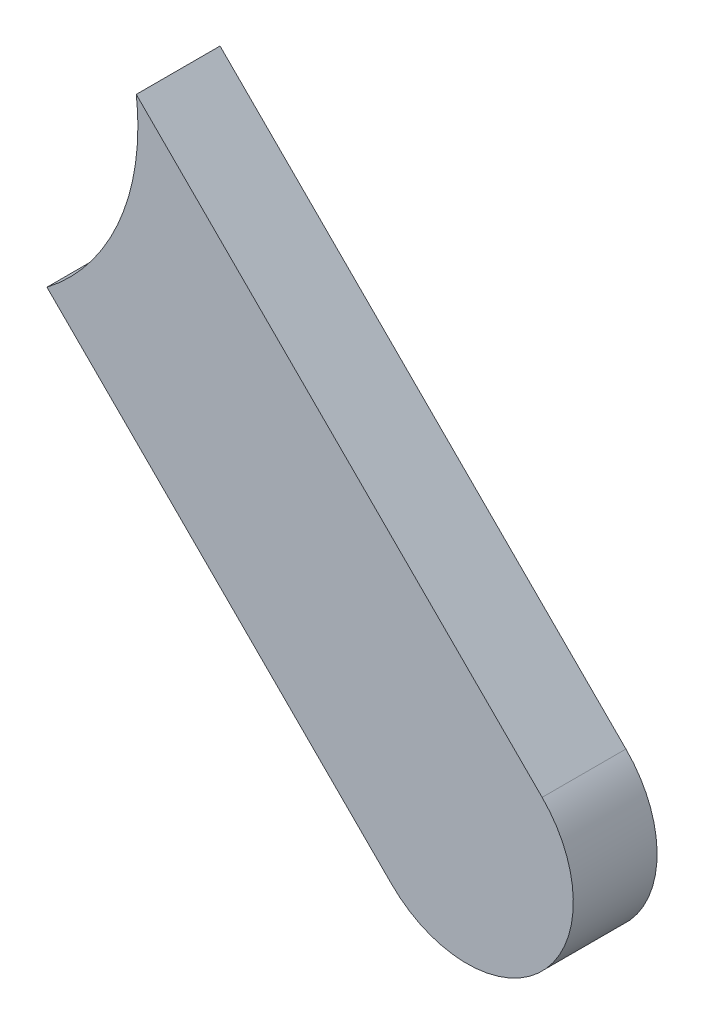
ISO-10303-21;
HEADER;
FILE_DESCRIPTION(('STEP AP214'),'2;1');
FILE_NAME('part.step','',(''),(''),'','','');
FILE_SCHEMA(('AUTOMOTIVE_DESIGN { 1 0 10303 214 1 1 1 1 }'));
ENDSEC;
DATA;
#1=APPLICATION_CONTEXT('core data for automotive mechanical design processes');
#2=APPLICATION_PROTOCOL_DEFINITION('international standard','automotive_design',2000,#1);
#3=PRODUCT_CONTEXT('',#1,'mechanical');
#4=PRODUCT('Part','Part','',(#3));
#5=PRODUCT_RELATED_PRODUCT_CATEGORY('part','',(#4));
#6=PRODUCT_DEFINITION_FORMATION('','',#4);
#7=PRODUCT_DEFINITION_CONTEXT('part definition',#1,'design');
#8=PRODUCT_DEFINITION('design','',#6,#7);
#9=PRODUCT_DEFINITION_SHAPE('','',#8);
#10=(LENGTH_UNIT() NAMED_UNIT(*) SI_UNIT(.MILLI.,.METRE.));
#11=(NAMED_UNIT(*) PLANE_ANGLE_UNIT() SI_UNIT($,.RADIAN.));
#12=(NAMED_UNIT(*) SI_UNIT($,.STERADIAN.) SOLID_ANGLE_UNIT());
#13=UNCERTAINTY_MEASURE_WITH_UNIT(LENGTH_MEASURE(1.E-05),#10,'distance_accuracy_value','');
#14=(GEOMETRIC_REPRESENTATION_CONTEXT(3) GLOBAL_UNCERTAINTY_ASSIGNED_CONTEXT((#13)) GLOBAL_UNIT_ASSIGNED_CONTEXT((#10,
#11,#12)) REPRESENTATION_CONTEXT('',''));
#15=CARTESIAN_POINT('',(0.,0.,0.));
#16=DIRECTION('',(0.,0.,1.));
#17=DIRECTION('',(1.,0.,0.));
#18=AXIS2_PLACEMENT_3D('',#15,#16,#17);
#19=CARTESIAN_POINT('',(149.308994996922,70.168793123078,0.));
#20=DIRECTION('',(0.707106781186543,0.707106781186552,0.));
#21=DIRECTION('',(0.707106781186552,-0.707106781186543,0.));
#22=AXIS2_PLACEMENT_3D('',#19,#20,#21);
#23=PLANE('',#22);
#24=DIRECTION('',(0.707106781186552,-0.707106781186543,0.));
#25=VECTOR('',#24,1.);
#26=CARTESIAN_POINT('',(149.04839126,70.42939686,0.1999996));
#27=LINE('',#26,#25);
#28=CARTESIAN_POINT('',(149.308994996922,70.168793123078,0.1999996));
#29=VERTEX_POINT('',#28);
#30=CARTESIAN_POINT('',(150.1318943,69.34589382,0.1999996));
#31=VERTEX_POINT('',#30);
#32=EDGE_CURVE('E11',#29,#31,#27,.T.);
#33=ORIENTED_EDGE('',*,*,#32,.F.);
#34=DIRECTION('',(0.,0.,1.));
#35=VECTOR('',#34,1.);
#36=CARTESIAN_POINT('',(149.308994996922,70.168793123078,0.));
#37=LINE('',#36,#35);
#38=CARTESIAN_POINT('',(149.308994996922,70.168793123078,0.));
#39=VERTEX_POINT('',#38);
#40=EDGE_CURVE('E24',#39,#29,#37,.T.);
#41=ORIENTED_EDGE('',*,*,#40,.F.);
#42=DIRECTION('',(0.707106781186552,-0.707106781186543,0.));
#43=VECTOR('',#42,1.);
#44=CARTESIAN_POINT('',(149.04839126,70.42939686,0.));
#45=LINE('',#44,#43);
#46=CARTESIAN_POINT('',(150.1318943,69.34589382,0.));
#47=VERTEX_POINT('',#46);
#48=EDGE_CURVE('E82',#39,#47,#45,.T.);
#49=ORIENTED_EDGE('',*,*,#48,.T.);
#50=DIRECTION('',(0.,0.,1.));
#51=VECTOR('',#50,1.);
#52=CARTESIAN_POINT('',(150.1318943,69.34589382,0.));
#53=LINE('',#52,#51);
#54=EDGE_CURVE('E37',#47,#31,#53,.T.);
#55=ORIENTED_EDGE('',*,*,#54,.T.);
#56=EDGE_LOOP('',(#33,#41,#49,#55));
#57=FACE_BOUND('',#56,.T.);
#58=ADVANCED_FACE('F17',(#57),#23,.F.);
#59=CARTESIAN_POINT('',(150.31150024,69.52549976,0.));
#60=DIRECTION('',(0.,0.,-1.));
#61=DIRECTION('',(-0.70710678118652,-0.707106781186576,0.));
#62=AXIS2_PLACEMENT_3D('',#59,#60,#61);
#63=CYLINDRICAL_SURFACE('',#62,0.254001156230774);
#64=CARTESIAN_POINT('',(150.31150024,69.52549976,0.1999996));
#65=DIRECTION('',(0.,0.,1.));
#66=DIRECTION('',(-0.70710678118652,-0.707106781186576,0.));
#67=AXIS2_PLACEMENT_3D('',#64,#65,#66);
#68=CIRCLE('',#67,0.254001156230774);
#69=CARTESIAN_POINT('',(150.49110618,69.7051057,0.1999996));
#70=VERTEX_POINT('',#69);
#71=EDGE_CURVE('E97',#31,#70,#68,.T.);
#72=ORIENTED_EDGE('',*,*,#71,.F.);
#73=ORIENTED_EDGE('',*,*,#54,.F.);
#74=CARTESIAN_POINT('',(150.31150024,69.52549976,0.));
#75=DIRECTION('',(0.,0.,1.));
#76=DIRECTION('',(-0.70710678118652,-0.707106781186576,0.));
#77=AXIS2_PLACEMENT_3D('',#74,#75,#76);
#78=CIRCLE('',#77,0.254001156230774);
#79=CARTESIAN_POINT('',(150.49110618,69.7051057,0.));
#80=VERTEX_POINT('',#79);
#81=EDGE_CURVE('E94',#47,#80,#78,.T.);
#82=ORIENTED_EDGE('',*,*,#81,.T.);
#83=DIRECTION('',(0.,0.,1.));
#84=VECTOR('',#83,1.);
#85=CARTESIAN_POINT('',(150.49110618,69.7051057,0.));
#86=LINE('',#85,#84);
#87=EDGE_CURVE('E92',#80,#70,#86,.T.);
#88=ORIENTED_EDGE('',*,*,#87,.T.);
#89=EDGE_LOOP('',(#72,#73,#82,#88));
#90=FACE_BOUND('',#89,.T.);
#91=ADVANCED_FACE('F103',(#90),#63,.T.);
#92=CARTESIAN_POINT('',(150.49110618,69.7051057,0.));
#93=DIRECTION('',(-0.707106781186543,-0.707106781186552,0.));
#94=DIRECTION('',(-0.707106781186552,0.707106781186543,0.));
#95=AXIS2_PLACEMENT_3D('',#92,#93,#94);
#96=PLANE('',#95);
#97=DIRECTION('',(-0.707106781186552,0.707106781186543,0.));
#98=VECTOR('',#97,1.);
#99=CARTESIAN_POINT('',(150.49110618,69.7051057,0.1999996));
#100=LINE('',#99,#98);
#101=CARTESIAN_POINT('',(149.522176918586,70.6740349614141,0.1999996));
#102=VERTEX_POINT('',#101);
#103=EDGE_CURVE('E89',#70,#102,#100,.T.);
#104=ORIENTED_EDGE('',*,*,#103,.F.);
#105=ORIENTED_EDGE('',*,*,#87,.F.);
#106=DIRECTION('',(-0.707106781186552,0.707106781186543,0.));
#107=VECTOR('',#106,1.);
#108=CARTESIAN_POINT('',(150.49110618,69.7051057,0.));
#109=LINE('',#108,#107);
#110=CARTESIAN_POINT('',(149.522176918586,70.6740349614141,0.));
#111=VERTEX_POINT('',#110);
#112=EDGE_CURVE('E87',#80,#111,#109,.T.);
#113=ORIENTED_EDGE('',*,*,#112,.T.);
#114=DIRECTION('',(0.,0.,1.));
#115=VECTOR('',#114,1.);
#116=CARTESIAN_POINT('',(149.522176918586,70.6740349614141,0.));
#117=LINE('',#116,#115);
#118=EDGE_CURVE('E69',#111,#102,#117,.T.);
#119=ORIENTED_EDGE('',*,*,#118,.T.);
#120=EDGE_LOOP('',(#104,#105,#113,#119));
#121=FACE_BOUND('',#120,.T.);
#122=ADVANCED_FACE('F108',(#121),#96,.F.);
#123=CARTESIAN_POINT('',(148.971,70.6090028,0.));
#124=DIRECTION('',(0.,0.,-1.));
#125=DIRECTION('',(1.,0.,0.));
#126=AXIS2_PLACEMENT_3D('',#123,#124,#125);
#127=CYLINDRICAL_SURFACE('',#126,0.55500016);
#128=DIRECTION('',(0.,0.,1.));
#129=VECTOR('',#128,1.);
#130=CARTESIAN_POINT('',(149.52600016,70.6090028,0.));
#131=LINE('',#130,#129);
#132=CARTESIAN_POINT('',(149.52600016,70.6090028,0.));
#133=VERTEX_POINT('',#132);
#134=CARTESIAN_POINT('',(149.52600016,70.6090028,0.1999996));
#135=VERTEX_POINT('',#134);
#136=EDGE_CURVE('E59',#133,#135,#131,.T.);
#137=ORIENTED_EDGE('',*,*,#136,.T.);
#138=CARTESIAN_POINT('',(148.971,70.6090028,0.1999996));
#139=DIRECTION('',(0.,0.,1.));
#140=DIRECTION('',(1.,0.,0.));
#141=AXIS2_PLACEMENT_3D('',#138,#139,#140);
#142=CIRCLE('',#141,0.55500016);
#143=EDGE_CURVE('E70',#135,#102,#142,.T.);
#144=ORIENTED_EDGE('',*,*,#143,.T.);
#145=ORIENTED_EDGE('',*,*,#118,.F.);
#146=CARTESIAN_POINT('',(148.971,70.6090028,0.));
#147=DIRECTION('',(0.,0.,1.));
#148=DIRECTION('',(1.,0.,0.));
#149=AXIS2_PLACEMENT_3D('',#146,#147,#148);
#150=CIRCLE('',#149,0.55500016);
#151=EDGE_CURVE('E73',#133,#111,#150,.T.);
#152=ORIENTED_EDGE('',*,*,#151,.F.);
#153=EDGE_LOOP('',(#137,#144,#145,#152));
#154=FACE_BOUND('',#153,.T.);
#155=ADVANCED_FACE('F74',(#154),#127,.F.);
#156=CARTESIAN_POINT('',(148.971,70.6090028,0.));
#157=DIRECTION('',(0.,0.,-1.));
#158=DIRECTION('',(1.,0.,0.));
#159=AXIS2_PLACEMENT_3D('',#156,#157,#158);
#160=CYLINDRICAL_SURFACE('',#159,0.55500016);
#161=ORIENTED_EDGE('',*,*,#40,.T.);
#162=CARTESIAN_POINT('',(148.971,70.6090028,0.1999996));
#163=DIRECTION('',(0.,0.,1.));
#164=DIRECTION('',(1.,0.,0.));
#165=AXIS2_PLACEMENT_3D('',#162,#163,#164);
#166=CIRCLE('',#165,0.55500016);
#167=EDGE_CURVE('E65',#29,#135,#166,.T.);
#168=ORIENTED_EDGE('',*,*,#167,.T.);
#169=ORIENTED_EDGE('',*,*,#136,.F.);
#170=EDGE_CURVE('E63',#39,#133,#150,.T.);
#171=ORIENTED_EDGE('',*,*,#170,.F.);
#172=EDGE_LOOP('',(#161,#168,#169,#171));
#173=FACE_BOUND('',#172,.T.);
#174=ADVANCED_FACE('F61',(#173),#160,.F.);
#175=CARTESIAN_POINT('',(149.04839126,70.42939686,0.));
#176=DIRECTION('',(0.,0.,-1.));
#177=DIRECTION('',(-1.,0.,0.));
#178=AXIS2_PLACEMENT_3D('',#175,#176,#177);
#179=PLANE('',#178);
#180=ORIENTED_EDGE('',*,*,#48,.F.);
#181=ORIENTED_EDGE('',*,*,#170,.T.);
#182=ORIENTED_EDGE('',*,*,#151,.T.);
#183=ORIENTED_EDGE('',*,*,#112,.F.);
#184=ORIENTED_EDGE('',*,*,#81,.F.);
#185=EDGE_LOOP('',(#180,#181,#182,#183,#184));
#186=FACE_BOUND('',#185,.T.);
#187=ADVANCED_FACE('F80',(#186),#179,.T.);
#188=CARTESIAN_POINT('',(149.04839126,70.42939686,0.1999996));
#189=DIRECTION('',(0.,0.,-1.));
#190=DIRECTION('',(-1.,0.,0.));
#191=AXIS2_PLACEMENT_3D('',#188,#189,#190);
#192=PLANE('',#191);
#193=ORIENTED_EDGE('',*,*,#167,.F.);
#194=ORIENTED_EDGE('',*,*,#32,.T.);
#195=ORIENTED_EDGE('',*,*,#71,.T.);
#196=ORIENTED_EDGE('',*,*,#103,.T.);
#197=ORIENTED_EDGE('',*,*,#143,.F.);
#198=EDGE_LOOP('',(#193,#194,#195,#196,#197));
#199=FACE_BOUND('',#198,.T.);
#200=ADVANCED_FACE('F106',(#199),#192,.F.);
#201=CLOSED_SHELL('',(#58,#91,#122,#155,#174,#187,#200));
#202=MANIFOLD_SOLID_BREP('B1',#201);
#203=ADVANCED_BREP_SHAPE_REPRESENTATION('',(#18,#202),#14);
#204=SHAPE_DEFINITION_REPRESENTATION(#9,#203);
ENDSEC;
END-ISO-10303-21;
